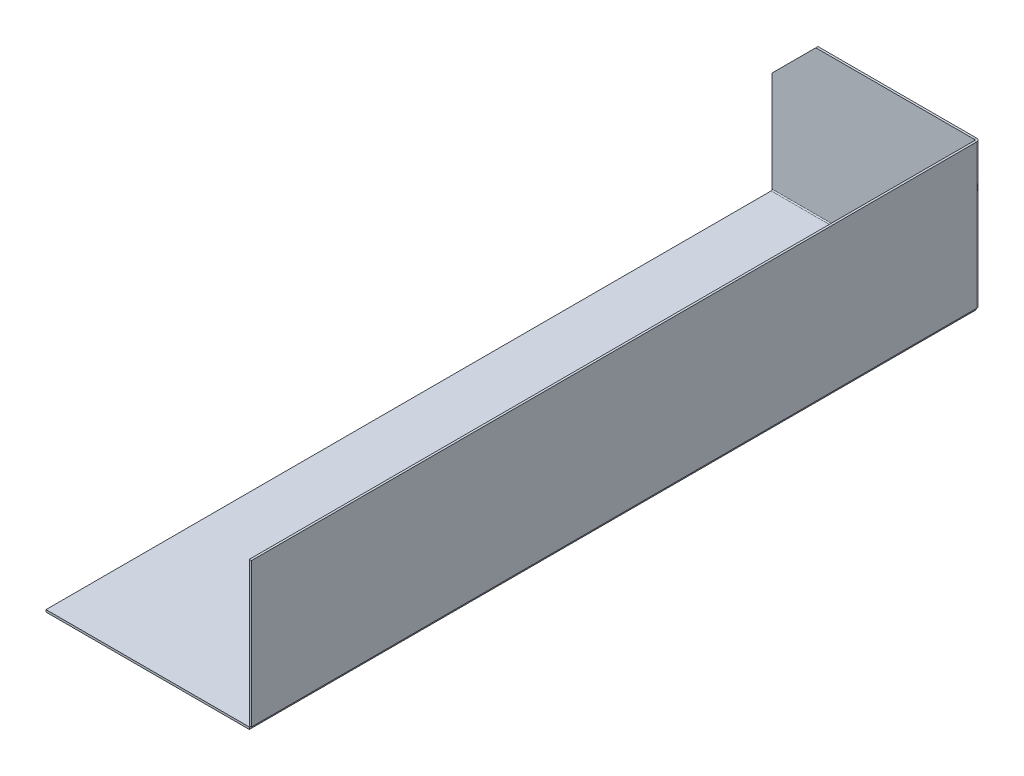
ISO-10303-21;
HEADER;
FILE_DESCRIPTION(('STEP AP214'),'2;1');
FILE_NAME('part.step','',(''),(''),'','','');
FILE_SCHEMA(('AUTOMOTIVE_DESIGN { 1 0 10303 214 1 1 1 1 }'));
ENDSEC;
DATA;
#1=APPLICATION_CONTEXT('core data for automotive mechanical design processes');
#2=APPLICATION_PROTOCOL_DEFINITION('international standard','automotive_design',2000,#1);
#3=PRODUCT_CONTEXT('',#1,'mechanical');
#4=PRODUCT('Part','Part','',(#3));
#5=PRODUCT_RELATED_PRODUCT_CATEGORY('part','',(#4));
#6=PRODUCT_DEFINITION_FORMATION('','',#4);
#7=PRODUCT_DEFINITION_CONTEXT('part definition',#1,'design');
#8=PRODUCT_DEFINITION('design','',#6,#7);
#9=PRODUCT_DEFINITION_SHAPE('','',#8);
#10=(LENGTH_UNIT() NAMED_UNIT(*) SI_UNIT(.MILLI.,.METRE.));
#11=(NAMED_UNIT(*) PLANE_ANGLE_UNIT() SI_UNIT($,.RADIAN.));
#12=(NAMED_UNIT(*) SI_UNIT($,.STERADIAN.) SOLID_ANGLE_UNIT());
#13=UNCERTAINTY_MEASURE_WITH_UNIT(LENGTH_MEASURE(1.E-05),#10,'distance_accuracy_value','');
#14=(GEOMETRIC_REPRESENTATION_CONTEXT(3) GLOBAL_UNCERTAINTY_ASSIGNED_CONTEXT((#13)) GLOBAL_UNIT_ASSIGNED_CONTEXT((#10,
#11,#12)) REPRESENTATION_CONTEXT('',''));
#15=CARTESIAN_POINT('',(0.,0.,0.));
#16=DIRECTION('',(0.,0.,1.));
#17=DIRECTION('',(1.,0.,0.));
#18=AXIS2_PLACEMENT_3D('',#15,#16,#17);
#19=CARTESIAN_POINT('',(139.2634,0.73659999999999,0.));
#20=DIRECTION('',(0.,1.,0.));
#21=DIRECTION('',(-1.,0.,0.));
#22=AXIS2_PLACEMENT_3D('',#19,#20,#21);
#23=PLANE('',#22);
#24=DIRECTION('',(1.,0.,0.));
#25=VECTOR('',#24,1.);
#26=CARTESIAN_POINT('',(140.,0.736599999999986,-1.49999999999999));
#27=LINE('',#26,#25);
#28=CARTESIAN_POINT('',(140.,0.736600000000008,-1.49999999999999));
#29=VERTEX_POINT('',#28);
#30=CARTESIAN_POINT('',(139.2634,0.736600000000001,-1.49999999999999));
#31=VERTEX_POINT('',#30);
#32=EDGE_CURVE('E231',#29,#31,#27,.F.);
#33=ORIENTED_EDGE('',*,*,#32,.T.);
#34=CARTESIAN_POINT('',(139.2634,0.73659999999999,0.736600000000006));
#35=DIRECTION('',(0.,1.,0.));
#36=DIRECTION('',(0.,0.,1.));
#37=AXIS2_PLACEMENT_3D('',#34,#35,#36);
#38=CIRCLE('',#37,2.2366);
#39=CARTESIAN_POINT('',(140.,0.736599999999975,-1.37522385629105));
#40=VERTEX_POINT('',#39);
#41=EDGE_CURVE('E183',#31,#40,#38,.F.);
#42=ORIENTED_EDGE('',*,*,#41,.T.);
#43=DIRECTION('',(0.,0.,-1.));
#44=VECTOR('',#43,1.);
#45=CARTESIAN_POINT('',(140.,0.736599999999997,0.));
#46=LINE('',#45,#44);
#47=EDGE_CURVE('E236',#40,#29,#46,.T.);
#48=ORIENTED_EDGE('',*,*,#47,.T.);
#49=EDGE_LOOP('',(#33,#42,#48));
#50=FACE_BOUND('',#49,.T.);
#51=ADVANCED_FACE('F37',(#50),#23,.T.);
#52=CARTESIAN_POINT('',(0.,0.,-1.5));
#53=DIRECTION('',(0.,0.,-1.));
#54=DIRECTION('',(-1.,0.,0.));
#55=AXIS2_PLACEMENT_3D('',#52,#53,#54);
#56=PLANE('',#55);
#57=DIRECTION('',(-1.,0.,0.));
#58=VECTOR('',#57,1.);
#59=CARTESIAN_POINT('',(140.,100.,-1.5));
#60=LINE('',#59,#58);
#61=CARTESIAN_POINT('',(139.2634,100.,-1.5));
#62=VERTEX_POINT('',#61);
#63=CARTESIAN_POINT('',(30.,100.,-1.5));
#64=VERTEX_POINT('',#63);
#65=EDGE_CURVE('E254',#62,#64,#60,.T.);
#66=ORIENTED_EDGE('',*,*,#65,.F.);
#67=DIRECTION('',(0.,1.,0.));
#68=VECTOR('',#67,1.);
#69=CARTESIAN_POINT('',(139.2634,100.,-1.5));
#70=LINE('',#69,#68);
#71=EDGE_CURVE('E179',#62,#31,#70,.F.);
#72=ORIENTED_EDGE('',*,*,#71,.T.);
#73=CARTESIAN_POINT('',(0.,0.736599999999997,-1.5));
#74=VERTEX_POINT('',#73);
#75=EDGE_CURVE('E60',#31,#74,#27,.F.);
#76=ORIENTED_EDGE('',*,*,#75,.T.);
#77=DIRECTION('',(0.,-1.,0.));
#78=VECTOR('',#77,1.);
#79=CARTESIAN_POINT('',(0.,0.,-1.5));
#80=LINE('',#79,#78);
#81=CARTESIAN_POINT('',(0.,70.,-1.5));
#82=VERTEX_POINT('',#81);
#83=EDGE_CURVE('E260',#82,#74,#80,.T.);
#84=ORIENTED_EDGE('',*,*,#83,.F.);
#85=DIRECTION('',(-0.707106781186547,-0.707106781186547,0.));
#86=VECTOR('',#85,1.);
#87=CARTESIAN_POINT('',(0.,70.,-1.5));
#88=LINE('',#87,#86);
#89=EDGE_CURVE('E256',#64,#82,#88,.T.);
#90=ORIENTED_EDGE('',*,*,#89,.F.);
#91=EDGE_LOOP('',(#66,#72,#76,#84,#90));
#92=FACE_BOUND('',#91,.T.);
#93=ADVANCED_FACE('F307',(#92),#56,.T.);
#94=CARTESIAN_POINT('',(0.,0.,0.));
#95=DIRECTION('',(0.,0.,-1.));
#96=DIRECTION('',(-1.,0.,0.));
#97=AXIS2_PLACEMENT_3D('',#94,#95,#96);
#98=PLANE('',#97);
#99=DIRECTION('',(0.,1.,0.));
#100=VECTOR('',#99,1.);
#101=CARTESIAN_POINT('',(139.2634,100.,0.));
#102=LINE('',#101,#100);
#103=CARTESIAN_POINT('',(139.2634,100.,0.));
#104=VERTEX_POINT('',#103);
#105=CARTESIAN_POINT('',(139.2634,0.736599999999997,0.));
#106=VERTEX_POINT('',#105);
#107=EDGE_CURVE('E192',#104,#106,#102,.F.);
#108=ORIENTED_EDGE('',*,*,#107,.F.);
#109=DIRECTION('',(-1.,0.,0.));
#110=VECTOR('',#109,1.);
#111=CARTESIAN_POINT('',(140.,100.,0.));
#112=LINE('',#111,#110);
#113=CARTESIAN_POINT('',(30.,100.,0.));
#114=VERTEX_POINT('',#113);
#115=EDGE_CURVE('E250',#104,#114,#112,.T.);
#116=ORIENTED_EDGE('',*,*,#115,.T.);
#117=DIRECTION('',(-0.707106781186547,-0.707106781186547,0.));
#118=VECTOR('',#117,1.);
#119=CARTESIAN_POINT('',(0.,70.,0.));
#120=LINE('',#119,#118);
#121=CARTESIAN_POINT('',(0.,70.,0.));
#122=VERTEX_POINT('',#121);
#123=EDGE_CURVE('E264',#114,#122,#120,.T.);
#124=ORIENTED_EDGE('',*,*,#123,.T.);
#125=DIRECTION('',(0.,-1.,0.));
#126=VECTOR('',#125,1.);
#127=CARTESIAN_POINT('',(0.,0.,0.));
#128=LINE('',#127,#126);
#129=CARTESIAN_POINT('',(0.,0.736599999999987,0.));
#130=VERTEX_POINT('',#129);
#131=EDGE_CURVE('E257',#122,#130,#128,.T.);
#132=ORIENTED_EDGE('',*,*,#131,.T.);
#133=DIRECTION('',(1.,0.,0.));
#134=VECTOR('',#133,1.);
#135=CARTESIAN_POINT('',(140.,0.736599999999997,0.));
#136=LINE('',#135,#134);
#137=EDGE_CURVE('E52',#106,#130,#136,.F.);
#138=ORIENTED_EDGE('',*,*,#137,.F.);
#139=EDGE_LOOP('',(#108,#116,#124,#132,#138));
#140=FACE_BOUND('',#139,.T.);
#141=ADVANCED_FACE('F269',(#140),#98,.F.);
#142=CARTESIAN_POINT('',(140.,100.,-1.5));
#143=DIRECTION('',(0.,1.,0.));
#144=DIRECTION('',(0.,0.,1.));
#145=AXIS2_PLACEMENT_3D('',#142,#143,#144);
#146=PLANE('',#145);
#147=ORIENTED_EDGE('',*,*,#115,.F.);
#148=DIRECTION('',(0.,0.,-1.));
#149=VECTOR('',#148,1.);
#150=CARTESIAN_POINT('',(139.2634,100.,0.));
#151=LINE('',#150,#149);
#152=EDGE_CURVE('E186',#104,#62,#151,.T.);
#153=ORIENTED_EDGE('',*,*,#152,.T.);
#154=ORIENTED_EDGE('',*,*,#65,.T.);
#155=DIRECTION('',(0.,0.,1.));
#156=VECTOR('',#155,1.);
#157=CARTESIAN_POINT('',(30.,100.,-1.5));
#158=LINE('',#157,#156);
#159=EDGE_CURVE('E41',#64,#114,#158,.T.);
#160=ORIENTED_EDGE('',*,*,#159,.T.);
#161=EDGE_LOOP('',(#147,#153,#154,#160));
#162=FACE_BOUND('',#161,.T.);
#163=ADVANCED_FACE('F39',(#162),#146,.T.);
#164=CARTESIAN_POINT('',(0.,0.,-1.5));
#165=DIRECTION('',(-1.,0.,0.));
#166=DIRECTION('',(0.,0.,1.));
#167=AXIS2_PLACEMENT_3D('',#164,#165,#166);
#168=PLANE('',#167);
#169=DIRECTION('',(0.,0.,-1.));
#170=VECTOR('',#169,1.);
#171=CARTESIAN_POINT('',(0.,0.736599999999987,0.));
#172=LINE('',#171,#170);
#173=EDGE_CURVE('E247',#130,#74,#172,.T.);
#174=ORIENTED_EDGE('',*,*,#173,.F.);
#175=ORIENTED_EDGE('',*,*,#131,.F.);
#176=DIRECTION('',(0.,0.,1.));
#177=VECTOR('',#176,1.);
#178=CARTESIAN_POINT('',(0.,70.,-1.5));
#179=LINE('',#178,#177);
#180=EDGE_CURVE('E11',#82,#122,#179,.T.);
#181=ORIENTED_EDGE('',*,*,#180,.F.);
#182=ORIENTED_EDGE('',*,*,#83,.T.);
#183=EDGE_LOOP('',(#174,#175,#181,#182));
#184=FACE_BOUND('',#183,.T.);
#185=ADVANCED_FACE('F272',(#184),#168,.T.);
#186=CARTESIAN_POINT('',(0.,70.,-1.5));
#187=DIRECTION('',(-0.707106781186548,0.707106781186548,0.));
#188=DIRECTION('',(-0.707106781186548,-0.707106781186548,0.));
#189=AXIS2_PLACEMENT_3D('',#186,#187,#188);
#190=PLANE('',#189);
#191=ORIENTED_EDGE('',*,*,#123,.F.);
#192=ORIENTED_EDGE('',*,*,#159,.F.);
#193=ORIENTED_EDGE('',*,*,#89,.T.);
#194=ORIENTED_EDGE('',*,*,#180,.T.);
#195=EDGE_LOOP('',(#191,#192,#193,#194));
#196=FACE_BOUND('',#195,.T.);
#197=ADVANCED_FACE('F366',(#196),#190,.T.);
#198=CARTESIAN_POINT('',(0.,0.736599999999992,0.7366));
#199=DIRECTION('',(-1.,0.,0.));
#200=DIRECTION('',(0.,-1.,0.));
#201=AXIS2_PLACEMENT_3D('',#198,#199,#200);
#202=PLANE('',#201);
#203=DIRECTION('',(0.,-1.,0.));
#204=VECTOR('',#203,1.);
#205=CARTESIAN_POINT('',(0.,0.,0.736599999999997));
#206=LINE('',#205,#204);
#207=CARTESIAN_POINT('',(0.,0.,0.736599999999997));
#208=VERTEX_POINT('',#207);
#209=CARTESIAN_POINT('',(0.,-1.5,0.736599999999992));
#210=VERTEX_POINT('',#209);
#211=EDGE_CURVE('E198',#208,#210,#206,.T.);
#212=ORIENTED_EDGE('',*,*,#211,.F.);
#213=CARTESIAN_POINT('',(0.,0.736599999999992,0.7366));
#214=DIRECTION('',(1.,0.,0.));
#215=DIRECTION('',(0.,1.,0.));
#216=AXIS2_PLACEMENT_3D('',#213,#214,#215);
#217=CIRCLE('',#216,0.736599999999995);
#218=EDGE_CURVE('E240',#130,#208,#217,.F.);
#219=ORIENTED_EDGE('',*,*,#218,.F.);
#220=ORIENTED_EDGE('',*,*,#173,.T.);
#221=CARTESIAN_POINT('',(0.,0.736599999999992,0.7366));
#222=DIRECTION('',(1.,0.,0.));
#223=DIRECTION('',(0.,1.,0.));
#224=AXIS2_PLACEMENT_3D('',#221,#222,#223);
#225=CIRCLE('',#224,2.23659999999999);
#226=EDGE_CURVE('E233',#74,#210,#225,.F.);
#227=ORIENTED_EDGE('',*,*,#226,.T.);
#228=EDGE_LOOP('',(#212,#219,#220,#227));
#229=FACE_BOUND('',#228,.T.);
#230=ADVANCED_FACE('F275',(#229),#202,.T.);
#231=CARTESIAN_POINT('',(140.,0.736600000000002,0.7366));
#232=DIRECTION('',(-1.,0.,0.));
#233=DIRECTION('',(0.,-1.,0.));
#234=AXIS2_PLACEMENT_3D('',#231,#232,#233);
#235=PLANE('',#234);
#236=CARTESIAN_POINT('',(140.,0.736600000000002,0.7366));
#237=DIRECTION('',(1.,0.,0.));
#238=DIRECTION('',(0.,1.,0.));
#239=AXIS2_PLACEMENT_3D('',#236,#237,#238);
#240=CIRCLE('',#239,0.736599999999995);
#241=CARTESIAN_POINT('',(140.,0.,0.736599999999997));
#242=VERTEX_POINT('',#241);
#243=CARTESIAN_POINT('',(140.,0.736599999999997,0.));
#244=VERTEX_POINT('',#243);
#245=EDGE_CURVE('E228',#242,#244,#240,.T.);
#246=ORIENTED_EDGE('',*,*,#245,.F.);
#247=DIRECTION('',(0.,-1.,0.));
#248=VECTOR('',#247,1.);
#249=CARTESIAN_POINT('',(140.,0.,0.736599999999997));
#250=LINE('',#249,#248);
#251=CARTESIAN_POINT('',(140.,-1.5,0.736599999999992));
#252=VERTEX_POINT('',#251);
#253=EDGE_CURVE('E201',#242,#252,#250,.T.);
#254=ORIENTED_EDGE('',*,*,#253,.T.);
#255=CARTESIAN_POINT('',(140.,0.736600000000002,0.7366));
#256=DIRECTION('',(1.,0.,0.));
#257=DIRECTION('',(0.,1.,0.));
#258=AXIS2_PLACEMENT_3D('',#255,#256,#257);
#259=CIRCLE('',#258,2.23659999999999);
#260=EDGE_CURVE('E237',#252,#29,#259,.T.);
#261=ORIENTED_EDGE('',*,*,#260,.T.);
#262=ORIENTED_EDGE('',*,*,#47,.F.);
#263=EDGE_CURVE('E251',#244,#40,#46,.T.);
#264=ORIENTED_EDGE('',*,*,#263,.F.);
#265=EDGE_LOOP('',(#246,#254,#261,#262,#264));
#266=FACE_BOUND('',#265,.T.);
#267=ADVANCED_FACE('F297',(#266),#235,.F.);
#268=CARTESIAN_POINT('',(140.,0.736600000000002,0.7366));
#269=DIRECTION('',(1.,0.,0.));
#270=DIRECTION('',(0.,-1.,0.));
#271=AXIS2_PLACEMENT_3D('',#268,#269,#270);
#272=CYLINDRICAL_SURFACE('',#271,2.23659999999999);
#273=ORIENTED_EDGE('',*,*,#32,.F.);
#274=ORIENTED_EDGE('',*,*,#260,.F.);
#275=DIRECTION('',(1.,0.,0.));
#276=VECTOR('',#275,1.);
#277=CARTESIAN_POINT('',(0.,-1.5,0.736599999999992));
#278=LINE('',#277,#276);
#279=EDGE_CURVE('E204',#210,#252,#278,.T.);
#280=ORIENTED_EDGE('',*,*,#279,.F.);
#281=ORIENTED_EDGE('',*,*,#226,.F.);
#282=ORIENTED_EDGE('',*,*,#75,.F.);
#283=EDGE_LOOP('',(#273,#274,#280,#281,#282));
#284=FACE_BOUND('',#283,.T.);
#285=ADVANCED_FACE('F302',(#284),#272,.T.);
#286=CARTESIAN_POINT('',(140.,0.736600000000002,0.7366));
#287=DIRECTION('',(1.,0.,0.));
#288=DIRECTION('',(0.,-1.,0.));
#289=AXIS2_PLACEMENT_3D('',#286,#287,#288);
#290=CYLINDRICAL_SURFACE('',#289,0.736599999999995);
#291=EDGE_CURVE('E243',#244,#106,#136,.F.);
#292=ORIENTED_EDGE('',*,*,#291,.T.);
#293=ORIENTED_EDGE('',*,*,#137,.T.);
#294=ORIENTED_EDGE('',*,*,#218,.T.);
#295=DIRECTION('',(1.,0.,0.));
#296=VECTOR('',#295,1.);
#297=CARTESIAN_POINT('',(0.,0.,0.736599999999997));
#298=LINE('',#297,#296);
#299=EDGE_CURVE('E199',#208,#242,#298,.T.);
#300=ORIENTED_EDGE('',*,*,#299,.T.);
#301=ORIENTED_EDGE('',*,*,#245,.T.);
#302=EDGE_LOOP('',(#292,#293,#294,#300,#301));
#303=FACE_BOUND('',#302,.T.);
#304=ADVANCED_FACE('F278',(#303),#290,.F.);
#305=CARTESIAN_POINT('',(140.,-1.5,0.));
#306=DIRECTION('',(1.,0.,0.));
#307=DIRECTION('',(0.,0.,-1.));
#308=AXIS2_PLACEMENT_3D('',#305,#306,#307);
#309=PLANE('',#308);
#310=DIRECTION('',(0.,0.,-1.));
#311=VECTOR('',#310,1.);
#312=CARTESIAN_POINT('',(140.,-1.5,0.));
#313=LINE('',#312,#311);
#314=CARTESIAN_POINT('',(140.,-1.50000000000175,500.));
#315=VERTEX_POINT('',#314);
#316=EDGE_CURVE('E216',#315,#252,#313,.T.);
#317=ORIENTED_EDGE('',*,*,#316,.T.);
#318=ORIENTED_EDGE('',*,*,#253,.F.);
#319=DIRECTION('',(0.,0.,-1.));
#320=VECTOR('',#319,1.);
#321=CARTESIAN_POINT('',(140.,0.,0.));
#322=LINE('',#321,#320);
#323=CARTESIAN_POINT('',(140.,-1.74574066942157E-12,500.));
#324=VERTEX_POINT('',#323);
#325=EDGE_CURVE('E213',#324,#242,#322,.T.);
#326=ORIENTED_EDGE('',*,*,#325,.F.);
#327=DIRECTION('',(0.,1.,0.));
#328=VECTOR('',#327,1.);
#329=CARTESIAN_POINT('',(140.,-1.50000000000175,500.));
#330=LINE('',#329,#328);
#331=EDGE_CURVE('E226',#315,#324,#330,.T.);
#332=ORIENTED_EDGE('',*,*,#331,.F.);
#333=EDGE_LOOP('',(#317,#318,#326,#332));
#334=FACE_BOUND('',#333,.T.);
#335=ADVANCED_FACE('F294',(#334),#309,.T.);
#336=CARTESIAN_POINT('',(0.,-1.50000000000175,500.));
#337=DIRECTION('',(-1.,0.,0.));
#338=DIRECTION('',(0.,0.,1.));
#339=AXIS2_PLACEMENT_3D('',#336,#337,#338);
#340=PLANE('',#339);
#341=DIRECTION('',(0.,0.,1.));
#342=VECTOR('',#341,1.);
#343=CARTESIAN_POINT('',(0.,-1.74574066942157E-12,500.));
#344=LINE('',#343,#342);
#345=CARTESIAN_POINT('',(0.,-1.74574066942157E-12,500.));
#346=VERTEX_POINT('',#345);
#347=EDGE_CURVE('E209',#208,#346,#344,.T.);
#348=ORIENTED_EDGE('',*,*,#347,.F.);
#349=ORIENTED_EDGE('',*,*,#211,.T.);
#350=DIRECTION('',(0.,0.,1.));
#351=VECTOR('',#350,1.);
#352=CARTESIAN_POINT('',(0.,-1.50000000000175,500.));
#353=LINE('',#352,#351);
#354=CARTESIAN_POINT('',(0.,-1.50000000000175,500.));
#355=VERTEX_POINT('',#354);
#356=EDGE_CURVE('E210',#210,#355,#353,.T.);
#357=ORIENTED_EDGE('',*,*,#356,.T.);
#358=DIRECTION('',(0.,1.,0.));
#359=VECTOR('',#358,1.);
#360=CARTESIAN_POINT('',(0.,-1.50000000000175,500.));
#361=LINE('',#360,#359);
#362=EDGE_CURVE('E219',#355,#346,#361,.T.);
#363=ORIENTED_EDGE('',*,*,#362,.T.);
#364=EDGE_LOOP('',(#348,#349,#357,#363));
#365=FACE_BOUND('',#364,.T.);
#366=ADVANCED_FACE('F286',(#365),#340,.T.);
#367=CARTESIAN_POINT('',(0.,-1.5,0.));
#368=DIRECTION('',(0.,-1.,0.));
#369=DIRECTION('',(0.,0.,-1.));
#370=AXIS2_PLACEMENT_3D('',#367,#368,#369);
#371=PLANE('',#370);
#372=ORIENTED_EDGE('',*,*,#356,.F.);
#373=ORIENTED_EDGE('',*,*,#279,.T.);
#374=ORIENTED_EDGE('',*,*,#316,.F.);
#375=DIRECTION('',(1.,0.,0.));
#376=VECTOR('',#375,1.);
#377=CARTESIAN_POINT('',(140.,-1.50000000000175,500.));
#378=LINE('',#377,#376);
#379=EDGE_CURVE('E212',#355,#315,#378,.T.);
#380=ORIENTED_EDGE('',*,*,#379,.F.);
#381=EDGE_LOOP('',(#372,#373,#374,#380));
#382=FACE_BOUND('',#381,.T.);
#383=ADVANCED_FACE('F299',(#382),#371,.T.);
#384=CARTESIAN_POINT('',(0.,0.,0.));
#385=DIRECTION('',(0.,-1.,0.));
#386=DIRECTION('',(0.,0.,-1.));
#387=AXIS2_PLACEMENT_3D('',#384,#385,#386);
#388=PLANE('',#387);
#389=ORIENTED_EDGE('',*,*,#299,.F.);
#390=ORIENTED_EDGE('',*,*,#347,.T.);
#391=DIRECTION('',(1.,0.,0.));
#392=VECTOR('',#391,1.);
#393=CARTESIAN_POINT('',(140.,-1.74574066942157E-12,500.));
#394=LINE('',#393,#392);
#395=EDGE_CURVE('E221',#346,#324,#394,.T.);
#396=ORIENTED_EDGE('',*,*,#395,.T.);
#397=ORIENTED_EDGE('',*,*,#325,.T.);
#398=EDGE_LOOP('',(#389,#390,#396,#397));
#399=FACE_BOUND('',#398,.T.);
#400=ADVANCED_FACE('F282',(#399),#388,.F.);
#401=CARTESIAN_POINT('',(140.,-1.50000000000175,500.));
#402=DIRECTION('',(0.,0.,1.));
#403=DIRECTION('',(0.,-1.,0.));
#404=AXIS2_PLACEMENT_3D('',#401,#402,#403);
#405=PLANE('',#404);
#406=ORIENTED_EDGE('',*,*,#395,.F.);
#407=ORIENTED_EDGE('',*,*,#362,.F.);
#408=ORIENTED_EDGE('',*,*,#379,.T.);
#409=ORIENTED_EDGE('',*,*,#331,.T.);
#410=EDGE_LOOP('',(#406,#407,#408,#409));
#411=FACE_BOUND('',#410,.T.);
#412=ADVANCED_FACE('F292',(#411),#405,.T.);
#413=CARTESIAN_POINT('',(139.2634,0.73659999999999,0.736600000000006));
#414=DIRECTION('',(0.,-1.,0.));
#415=DIRECTION('',(0.,0.,-1.));
#416=AXIS2_PLACEMENT_3D('',#413,#414,#415);
#417=PLANE('',#416);
#418=ORIENTED_EDGE('',*,*,#291,.F.);
#419=ORIENTED_EDGE('',*,*,#263,.T.);
#420=CARTESIAN_POINT('',(141.5,0.73659999999999,0.736599999999999));
#421=VERTEX_POINT('',#420);
#422=EDGE_CURVE('E181',#40,#421,#38,.F.);
#423=ORIENTED_EDGE('',*,*,#422,.T.);
#424=DIRECTION('',(1.,0.,0.));
#425=VECTOR('',#424,1.);
#426=CARTESIAN_POINT('',(140.,0.736600000000008,0.736600000000004));
#427=LINE('',#426,#425);
#428=CARTESIAN_POINT('',(140.,0.73659999999999,0.736600000000004));
#429=VERTEX_POINT('',#428);
#430=EDGE_CURVE('E149',#429,#421,#427,.T.);
#431=ORIENTED_EDGE('',*,*,#430,.F.);
#432=CARTESIAN_POINT('',(139.2634,0.73659999999999,0.736600000000006));
#433=DIRECTION('',(0.,1.,0.));
#434=DIRECTION('',(0.,0.,1.));
#435=AXIS2_PLACEMENT_3D('',#432,#433,#434);
#436=CIRCLE('',#435,0.736600000000004);
#437=EDGE_CURVE('E189',#106,#429,#436,.F.);
#438=ORIENTED_EDGE('',*,*,#437,.F.);
#439=EDGE_LOOP('',(#418,#419,#423,#431,#438));
#440=FACE_BOUND('',#439,.T.);
#441=ADVANCED_FACE('F335',(#440),#417,.T.);
#442=CARTESIAN_POINT('',(139.2634,100.,0.736600000000006));
#443=DIRECTION('',(0.,-1.,0.));
#444=DIRECTION('',(0.,0.,-1.));
#445=AXIS2_PLACEMENT_3D('',#442,#443,#444);
#446=PLANE('',#445);
#447=CARTESIAN_POINT('',(139.2634,100.,0.736600000000006));
#448=DIRECTION('',(0.,1.,0.));
#449=DIRECTION('',(0.,0.,1.));
#450=AXIS2_PLACEMENT_3D('',#447,#448,#449);
#451=CIRCLE('',#450,0.736600000000004);
#452=CARTESIAN_POINT('',(140.,100.,0.736600000000004));
#453=VERTEX_POINT('',#452);
#454=EDGE_CURVE('E177',#453,#104,#451,.T.);
#455=ORIENTED_EDGE('',*,*,#454,.F.);
#456=DIRECTION('',(1.,0.,0.));
#457=VECTOR('',#456,1.);
#458=CARTESIAN_POINT('',(140.,100.,0.736600000000004));
#459=LINE('',#458,#457);
#460=CARTESIAN_POINT('',(141.5,100.,0.736599999999999));
#461=VERTEX_POINT('',#460);
#462=EDGE_CURVE('E319',#453,#461,#459,.T.);
#463=ORIENTED_EDGE('',*,*,#462,.T.);
#464=CARTESIAN_POINT('',(139.2634,100.,0.736600000000006));
#465=DIRECTION('',(0.,1.,0.));
#466=DIRECTION('',(0.,0.,1.));
#467=AXIS2_PLACEMENT_3D('',#464,#465,#466);
#468=CIRCLE('',#467,2.2366);
#469=EDGE_CURVE('E182',#461,#62,#468,.T.);
#470=ORIENTED_EDGE('',*,*,#469,.T.);
#471=ORIENTED_EDGE('',*,*,#152,.F.);
#472=EDGE_LOOP('',(#455,#463,#470,#471));
#473=FACE_BOUND('',#472,.T.);
#474=ADVANCED_FACE('F317',(#473),#446,.F.);
#475=CARTESIAN_POINT('',(139.2634,100.,0.736600000000006));
#476=DIRECTION('',(0.,1.,0.));
#477=DIRECTION('',(1.,0.,0.));
#478=AXIS2_PLACEMENT_3D('',#475,#476,#477);
#479=CYLINDRICAL_SURFACE('',#478,2.2366);
#480=ORIENTED_EDGE('',*,*,#71,.F.);
#481=ORIENTED_EDGE('',*,*,#469,.F.);
#482=DIRECTION('',(0.,1.,0.));
#483=VECTOR('',#482,1.);
#484=CARTESIAN_POINT('',(141.5,0.,0.736599999999999));
#485=LINE('',#484,#483);
#486=EDGE_CURVE('E173',#421,#461,#485,.T.);
#487=ORIENTED_EDGE('',*,*,#486,.F.);
#488=ORIENTED_EDGE('',*,*,#422,.F.);
#489=ORIENTED_EDGE('',*,*,#41,.F.);
#490=EDGE_LOOP('',(#480,#481,#487,#488,#489));
#491=FACE_BOUND('',#490,.T.);
#492=ADVANCED_FACE('F310',(#491),#479,.T.);
#493=CARTESIAN_POINT('',(139.2634,100.,0.736600000000006));
#494=DIRECTION('',(0.,1.,0.));
#495=DIRECTION('',(1.,0.,0.));
#496=AXIS2_PLACEMENT_3D('',#493,#494,#495);
#497=CYLINDRICAL_SURFACE('',#496,0.736600000000004);
#498=ORIENTED_EDGE('',*,*,#107,.T.);
#499=ORIENTED_EDGE('',*,*,#437,.T.);
#500=DIRECTION('',(0.,1.,0.));
#501=VECTOR('',#500,1.);
#502=CARTESIAN_POINT('',(140.,0.736600000000008,0.736600000000004));
#503=LINE('',#502,#501);
#504=EDGE_CURVE('E322',#429,#453,#503,.T.);
#505=ORIENTED_EDGE('',*,*,#504,.T.);
#506=ORIENTED_EDGE('',*,*,#454,.T.);
#507=EDGE_LOOP('',(#498,#499,#505,#506));
#508=FACE_BOUND('',#507,.T.);
#509=ADVANCED_FACE('F331',(#508),#497,.F.);
#510=CARTESIAN_POINT('',(141.5,100.,0.));
#511=DIRECTION('',(0.,1.,0.));
#512=DIRECTION('',(0.,0.,1.));
#513=AXIS2_PLACEMENT_3D('',#510,#511,#512);
#514=PLANE('',#513);
#515=DIRECTION('',(0.,0.,-1.));
#516=VECTOR('',#515,1.);
#517=CARTESIAN_POINT('',(141.5,100.,0.));
#518=LINE('',#517,#516);
#519=CARTESIAN_POINT('',(141.500000000002,100.,500.));
#520=VERTEX_POINT('',#519);
#521=EDGE_CURVE('E163',#520,#461,#518,.T.);
#522=ORIENTED_EDGE('',*,*,#521,.T.);
#523=ORIENTED_EDGE('',*,*,#462,.F.);
#524=DIRECTION('',(0.,0.,-1.));
#525=VECTOR('',#524,1.);
#526=CARTESIAN_POINT('',(140.,100.,0.));
#527=LINE('',#526,#525);
#528=CARTESIAN_POINT('',(140.000000000002,100.,500.));
#529=VERTEX_POINT('',#528);
#530=EDGE_CURVE('E154',#529,#453,#527,.T.);
#531=ORIENTED_EDGE('',*,*,#530,.F.);
#532=DIRECTION('',(-1.,0.,0.));
#533=VECTOR('',#532,1.);
#534=CARTESIAN_POINT('',(141.500000000002,100.,500.));
#535=LINE('',#534,#533);
#536=EDGE_CURVE('E162',#520,#529,#535,.T.);
#537=ORIENTED_EDGE('',*,*,#536,.F.);
#538=EDGE_LOOP('',(#522,#523,#531,#537));
#539=FACE_BOUND('',#538,.T.);
#540=ADVANCED_FACE('F324',(#539),#514,.T.);
#541=CARTESIAN_POINT('',(141.500000000002,0.73660000000002,500.));
#542=DIRECTION('',(0.,-1.,0.));
#543=DIRECTION('',(0.,0.,-1.));
#544=AXIS2_PLACEMENT_3D('',#541,#542,#543);
#545=PLANE('',#544);
#546=DIRECTION('',(0.,0.,1.));
#547=VECTOR('',#546,1.);
#548=CARTESIAN_POINT('',(140.000000000002,0.73660000000002,500.));
#549=LINE('',#548,#547);
#550=CARTESIAN_POINT('',(140.000000000002,0.73660000000002,500.));
#551=VERTEX_POINT('',#550);
#552=EDGE_CURVE('E171',#429,#551,#549,.T.);
#553=ORIENTED_EDGE('',*,*,#552,.F.);
#554=ORIENTED_EDGE('',*,*,#430,.T.);
#555=DIRECTION('',(0.,0.,1.));
#556=VECTOR('',#555,1.);
#557=CARTESIAN_POINT('',(141.500000000002,0.73660000000002,500.));
#558=LINE('',#557,#556);
#559=CARTESIAN_POINT('',(141.500000000002,0.73660000000002,500.));
#560=VERTEX_POINT('',#559);
#561=EDGE_CURVE('E143',#421,#560,#558,.T.);
#562=ORIENTED_EDGE('',*,*,#561,.T.);
#563=DIRECTION('',(-1.,0.,0.));
#564=VECTOR('',#563,1.);
#565=CARTESIAN_POINT('',(141.500000000002,0.73660000000002,500.));
#566=LINE('',#565,#564);
#567=EDGE_CURVE('E147',#560,#551,#566,.T.);
#568=ORIENTED_EDGE('',*,*,#567,.T.);
#569=EDGE_LOOP('',(#553,#554,#562,#568));
#570=FACE_BOUND('',#569,.T.);
#571=ADVANCED_FACE('F146',(#570),#545,.T.);
#572=CARTESIAN_POINT('',(141.5,0.,-4.94845575867959E-13));
#573=DIRECTION('',(1.,0.,0.));
#574=DIRECTION('',(0.,0.,-1.));
#575=AXIS2_PLACEMENT_3D('',#572,#573,#574);
#576=PLANE('',#575);
#577=ORIENTED_EDGE('',*,*,#561,.F.);
#578=ORIENTED_EDGE('',*,*,#486,.T.);
#579=ORIENTED_EDGE('',*,*,#521,.F.);
#580=DIRECTION('',(0.,1.,0.));
#581=VECTOR('',#580,1.);
#582=CARTESIAN_POINT('',(141.500000000002,100.,500.));
#583=LINE('',#582,#581);
#584=EDGE_CURVE('E153',#560,#520,#583,.T.);
#585=ORIENTED_EDGE('',*,*,#584,.F.);
#586=EDGE_LOOP('',(#577,#578,#579,#585));
#587=FACE_BOUND('',#586,.T.);
#588=ADVANCED_FACE('F165',(#587),#576,.T.);
#589=CARTESIAN_POINT('',(140.,0.,-4.89608353859694E-13));
#590=DIRECTION('',(1.,0.,0.));
#591=DIRECTION('',(0.,0.,-1.));
#592=AXIS2_PLACEMENT_3D('',#589,#590,#591);
#593=PLANE('',#592);
#594=ORIENTED_EDGE('',*,*,#504,.F.);
#595=ORIENTED_EDGE('',*,*,#552,.T.);
#596=DIRECTION('',(0.,1.,0.));
#597=VECTOR('',#596,1.);
#598=CARTESIAN_POINT('',(140.000000000002,100.,500.));
#599=LINE('',#598,#597);
#600=EDGE_CURVE('E161',#551,#529,#599,.T.);
#601=ORIENTED_EDGE('',*,*,#600,.T.);
#602=ORIENTED_EDGE('',*,*,#530,.T.);
#603=EDGE_LOOP('',(#594,#595,#601,#602));
#604=FACE_BOUND('',#603,.T.);
#605=ADVANCED_FACE('F327',(#604),#593,.F.);
#606=CARTESIAN_POINT('',(141.500000000002,100.,500.));
#607=DIRECTION('',(0.,0.,1.));
#608=DIRECTION('',(1.,0.,0.));
#609=AXIS2_PLACEMENT_3D('',#606,#607,#608);
#610=PLANE('',#609);
#611=ORIENTED_EDGE('',*,*,#600,.F.);
#612=ORIENTED_EDGE('',*,*,#567,.F.);
#613=ORIENTED_EDGE('',*,*,#584,.T.);
#614=ORIENTED_EDGE('',*,*,#536,.T.);
#615=EDGE_LOOP('',(#611,#612,#613,#614));
#616=FACE_BOUND('',#615,.T.);
#617=ADVANCED_FACE('F158',(#616),#610,.T.);
#618=CLOSED_SHELL('',(#51,#93,#141,#163,#185,#197,#230,#267,#285,#304,#335,#366,#383,#400,#412,
#441,#474,#492,#509,#540,#571,#588,#605,#617));
#619=MANIFOLD_SOLID_BREP('B2',#618);
#620=ADVANCED_BREP_SHAPE_REPRESENTATION('',(#18,#619),#14);
#621=SHAPE_DEFINITION_REPRESENTATION(#9,#620);
ENDSEC;
END-ISO-10303-21;
